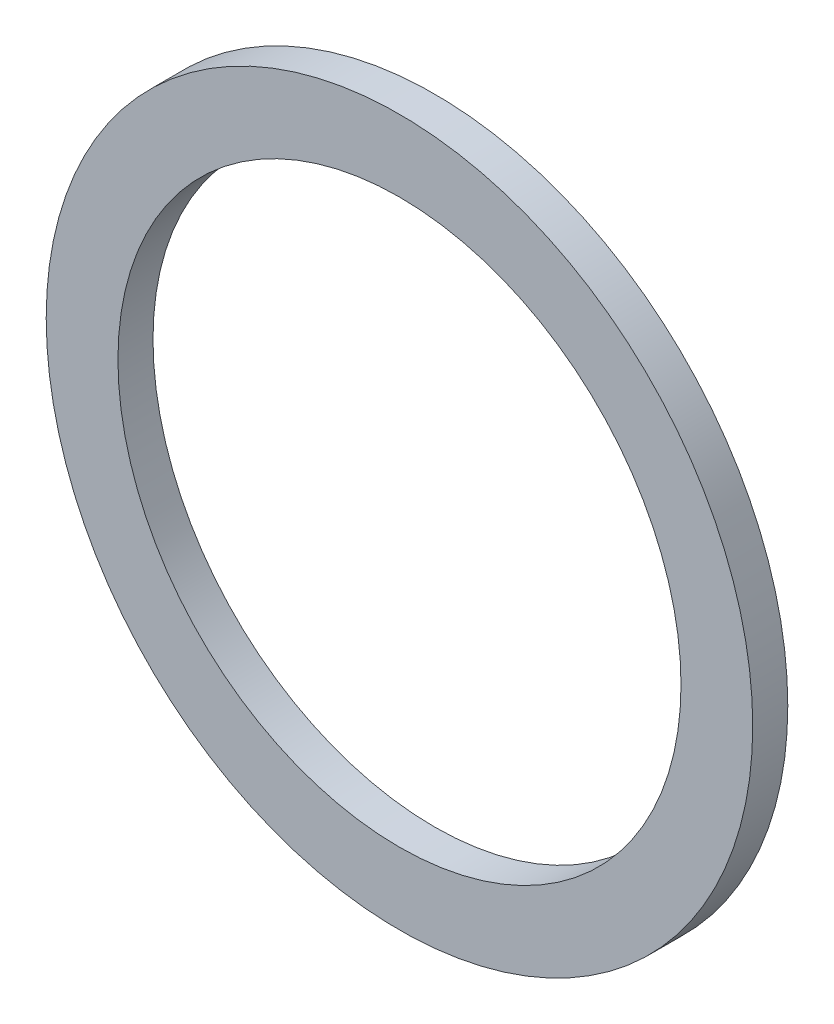
ISO-10303-21;
HEADER;
FILE_DESCRIPTION(('STEP AP214'),'2;1');
FILE_NAME('part.step','',(''),(''),'','','');
FILE_SCHEMA(('AUTOMOTIVE_DESIGN { 1 0 10303 214 1 1 1 1 }'));
ENDSEC;
DATA;
#1=APPLICATION_CONTEXT('core data for automotive mechanical design processes');
#2=APPLICATION_PROTOCOL_DEFINITION('international standard','automotive_design',2000,#1);
#3=PRODUCT_CONTEXT('',#1,'mechanical');
#4=PRODUCT('Part','Part','',(#3));
#5=PRODUCT_RELATED_PRODUCT_CATEGORY('part','',(#4));
#6=PRODUCT_DEFINITION_FORMATION('','',#4);
#7=PRODUCT_DEFINITION_CONTEXT('part definition',#1,'design');
#8=PRODUCT_DEFINITION('design','',#6,#7);
#9=PRODUCT_DEFINITION_SHAPE('','',#8);
#10=(LENGTH_UNIT() NAMED_UNIT(*) SI_UNIT(.MILLI.,.METRE.));
#11=(NAMED_UNIT(*) PLANE_ANGLE_UNIT() SI_UNIT($,.RADIAN.));
#12=(NAMED_UNIT(*) SI_UNIT($,.STERADIAN.) SOLID_ANGLE_UNIT());
#13=UNCERTAINTY_MEASURE_WITH_UNIT(LENGTH_MEASURE(1.E-05),#10,'distance_accuracy_value','');
#14=(GEOMETRIC_REPRESENTATION_CONTEXT(3) GLOBAL_UNCERTAINTY_ASSIGNED_CONTEXT((#13)) GLOBAL_UNIT_ASSIGNED_CONTEXT((#10,
#11,#12)) REPRESENTATION_CONTEXT('',''));
#15=CARTESIAN_POINT('',(0.,0.,0.));
#16=DIRECTION('',(0.,0.,1.));
#17=DIRECTION('',(1.,0.,0.));
#18=AXIS2_PLACEMENT_3D('',#15,#16,#17);
#19=CARTESIAN_POINT('',(0.,0.,3.25));
#20=DIRECTION('',(0.,0.,1.));
#21=DIRECTION('',(1.,0.,0.));
#22=AXIS2_PLACEMENT_3D('',#19,#20,#21);
#23=PLANE('',#22);
#24=CARTESIAN_POINT('',(0.,0.,3.25));
#25=DIRECTION('',(0.,0.,1.));
#26=DIRECTION('',(1.,0.,0.));
#27=AXIS2_PLACEMENT_3D('',#24,#25,#26);
#28=CIRCLE('',#27,32.75);
#29=CARTESIAN_POINT('',(-32.75,0.,3.25));
#30=VERTEX_POINT('',#29);
#31=EDGE_CURVE('E10',#30,#30,#28,.T.);
#32=ORIENTED_EDGE('',*,*,#31,.T.);
#33=EDGE_LOOP('',(#32));
#34=FACE_BOUND('',#33,.T.);
#35=CARTESIAN_POINT('',(0.,0.,3.25));
#36=DIRECTION('',(0.,0.,1.));
#37=DIRECTION('',(1.,0.,0.));
#38=AXIS2_PLACEMENT_3D('',#35,#36,#37);
#39=CIRCLE('',#38,26.1);
#40=CARTESIAN_POINT('',(-26.1,0.,3.25));
#41=VERTEX_POINT('',#40);
#42=EDGE_CURVE('E54',#41,#41,#39,.T.);
#43=ORIENTED_EDGE('',*,*,#42,.F.);
#44=EDGE_LOOP('',(#43));
#45=FACE_BOUND('',#44,.T.);
#46=ADVANCED_FACE('F41',(#34,#45),#23,.T.);
#47=CARTESIAN_POINT('',(0.,0.,0.));
#48=DIRECTION('',(0.,0.,1.));
#49=DIRECTION('',(1.,0.,0.));
#50=AXIS2_PLACEMENT_3D('',#47,#48,#49);
#51=PLANE('',#50);
#52=CARTESIAN_POINT('',(0.,0.,0.));
#53=DIRECTION('',(0.,0.,1.));
#54=DIRECTION('',(1.,0.,0.));
#55=AXIS2_PLACEMENT_3D('',#52,#53,#54);
#56=CIRCLE('',#55,32.75);
#57=CARTESIAN_POINT('',(-32.75,0.,0.));
#58=VERTEX_POINT('',#57);
#59=EDGE_CURVE('E45',#58,#58,#56,.T.);
#60=ORIENTED_EDGE('',*,*,#59,.F.);
#61=EDGE_LOOP('',(#60));
#62=FACE_BOUND('',#61,.T.);
#63=CARTESIAN_POINT('',(0.,0.,0.));
#64=DIRECTION('',(0.,0.,1.));
#65=DIRECTION('',(1.,0.,0.));
#66=AXIS2_PLACEMENT_3D('',#63,#64,#65);
#67=CIRCLE('',#66,26.1);
#68=CARTESIAN_POINT('',(-26.1,0.,0.));
#69=VERTEX_POINT('',#68);
#70=EDGE_CURVE('E56',#69,#69,#67,.T.);
#71=ORIENTED_EDGE('',*,*,#70,.T.);
#72=EDGE_LOOP('',(#71));
#73=FACE_BOUND('',#72,.T.);
#74=ADVANCED_FACE('F68',(#62,#73),#51,.F.);
#75=CARTESIAN_POINT('',(0.,0.,3.25));
#76=DIRECTION('',(0.,0.,-1.));
#77=DIRECTION('',(-1.,0.,0.));
#78=AXIS2_PLACEMENT_3D('',#75,#76,#77);
#79=CYLINDRICAL_SURFACE('',#78,32.75);
#80=CARTESIAN_POINT('',(-32.75,0.,3.25));
#81=CARTESIAN_POINT('',(-32.75,0.,3.21614583333333));
#82=CARTESIAN_POINT('',(-32.75,0.,3.18229166666667));
#83=CARTESIAN_POINT('',(-32.75,0.,3.11458333333333));
#84=CARTESIAN_POINT('',(-32.75,0.,3.08072916666667));
#85=CARTESIAN_POINT('',(-32.75,0.,3.01302083333333));
#86=CARTESIAN_POINT('',(-32.75,0.,2.97916666666667));
#87=CARTESIAN_POINT('',(-32.75,0.,2.91145833333333));
#88=CARTESIAN_POINT('',(-32.75,0.,2.87760416666667));
#89=CARTESIAN_POINT('',(-32.75,0.,2.80989583333333));
#90=CARTESIAN_POINT('',(-32.75,0.,2.77604166666667));
#91=CARTESIAN_POINT('',(-32.75,0.,2.70833333333333));
#92=CARTESIAN_POINT('',(-32.75,0.,2.67447916666667));
#93=CARTESIAN_POINT('',(-32.75,0.,2.60677083333333));
#94=CARTESIAN_POINT('',(-32.75,0.,2.57291666666667));
#95=CARTESIAN_POINT('',(-32.75,0.,2.50520833333333));
#96=CARTESIAN_POINT('',(-32.75,0.,2.47135416666667));
#97=CARTESIAN_POINT('',(-32.75,0.,2.40364583333333));
#98=CARTESIAN_POINT('',(-32.75,0.,2.36979166666667));
#99=CARTESIAN_POINT('',(-32.75,0.,2.30208333333333));
#100=CARTESIAN_POINT('',(-32.75,0.,2.26822916666667));
#101=CARTESIAN_POINT('',(-32.75,0.,2.20052083333333));
#102=CARTESIAN_POINT('',(-32.75,0.,2.16666666666667));
#103=CARTESIAN_POINT('',(-32.75,0.,2.09895833333333));
#104=CARTESIAN_POINT('',(-32.75,0.,2.06510416666667));
#105=CARTESIAN_POINT('',(-32.75,0.,1.99739583333333));
#106=CARTESIAN_POINT('',(-32.75,0.,1.96354166666667));
#107=CARTESIAN_POINT('',(-32.75,0.,1.89583333333333));
#108=CARTESIAN_POINT('',(-32.75,0.,1.86197916666667));
#109=CARTESIAN_POINT('',(-32.75,0.,1.79427083333333));
#110=CARTESIAN_POINT('',(-32.75,0.,1.76041666666667));
#111=CARTESIAN_POINT('',(-32.75,0.,1.69270833333333));
#112=CARTESIAN_POINT('',(-32.75,0.,1.65885416666667));
#113=CARTESIAN_POINT('',(-32.75,0.,1.59114583333333));
#114=CARTESIAN_POINT('',(-32.75,0.,1.55729166666667));
#115=CARTESIAN_POINT('',(-32.75,0.,1.48958333333333));
#116=CARTESIAN_POINT('',(-32.75,0.,1.45572916666667));
#117=CARTESIAN_POINT('',(-32.75,0.,1.38802083333333));
#118=CARTESIAN_POINT('',(-32.75,0.,1.35416666666667));
#119=CARTESIAN_POINT('',(-32.75,0.,1.28645833333333));
#120=CARTESIAN_POINT('',(-32.75,0.,1.25260416666667));
#121=CARTESIAN_POINT('',(-32.75,0.,1.18489583333333));
#122=CARTESIAN_POINT('',(-32.75,0.,1.15104166666667));
#123=CARTESIAN_POINT('',(-32.75,0.,1.08333333333333));
#124=CARTESIAN_POINT('',(-32.75,0.,1.04947916666667));
#125=CARTESIAN_POINT('',(-32.75,0.,0.981770833333333));
#126=CARTESIAN_POINT('',(-32.75,0.,0.947916666666667));
#127=CARTESIAN_POINT('',(-32.75,0.,0.880208333333333));
#128=CARTESIAN_POINT('',(-32.75,0.,0.846354166666667));
#129=CARTESIAN_POINT('',(-32.75,0.,0.778645833333333));
#130=CARTESIAN_POINT('',(-32.75,0.,0.744791666666667));
#131=CARTESIAN_POINT('',(-32.75,0.,0.677083333333333));
#132=CARTESIAN_POINT('',(-32.75,0.,0.643229166666667));
#133=CARTESIAN_POINT('',(-32.75,0.,0.575520833333333));
#134=CARTESIAN_POINT('',(-32.75,0.,0.541666666666667));
#135=CARTESIAN_POINT('',(-32.75,0.,0.473958333333333));
#136=CARTESIAN_POINT('',(-32.75,0.,0.440104166666667));
#137=CARTESIAN_POINT('',(-32.75,0.,0.372395833333333));
#138=CARTESIAN_POINT('',(-32.75,0.,0.338541666666667));
#139=CARTESIAN_POINT('',(-32.75,0.,0.270833333333333));
#140=CARTESIAN_POINT('',(-32.75,0.,0.236979166666667));
#141=CARTESIAN_POINT('',(-32.75,0.,0.169270833333333));
#142=CARTESIAN_POINT('',(-32.75,0.,0.135416666666667));
#143=CARTESIAN_POINT('',(-32.75,0.,0.0677083333333334));
#144=CARTESIAN_POINT('',(-32.75,0.,0.0338541666666667));
#145=CARTESIAN_POINT('',(-32.75,0.,0.));
#146=B_SPLINE_CURVE_WITH_KNOTS('',3,(#80,#81,#82,#83,#84,#85,#86,#87,#88,#89,#90,#91,#92,#93,
#94,#95,#96,#97,#98,#99,#100,#101,#102,#103,#104,#105,#106,#107,#108,#109,#110,#111,#112,#113,
#114,#115,#116,#117,#118,#119,#120,#121,#122,#123,#124,#125,#126,#127,#128,#129,#130,#131,#132,
#133,#134,#135,#136,#137,#138,#139,#140,#141,#142,#143,#144,#145),.UNSPECIFIED.,.F.,.F.,(4,2,2,
2,2,2,2,2,2,2,2,2,2,2,2,2,2,2,2,2,2,2,2,2,2,2,2,2,2,2,2,2,4),(0.,0.1015625,0.203125,0.3046875,
0.40625,0.5078125,0.609375,0.7109375,0.8125,0.9140625,1.015625,1.1171875,1.21875,1.3203125,
1.421875,1.5234375,1.625,1.7265625,1.828125,1.9296875,2.03125,2.1328125,2.234375,2.3359375,
2.4375,2.5390625,2.640625,2.7421875,2.84375,2.9453125,3.046875,3.1484375,3.25),.UNSPECIFIED.);
#147=EDGE_CURVE('BSEAM43',#30,#58,#146,.T.);
#148=ORIENTED_EDGE('',*,*,#31,.F.);
#149=ORIENTED_EDGE('',*,*,#59,.T.);
#150=ORIENTED_EDGE('',*,*,#147,.T.);
#151=ORIENTED_EDGE('',*,*,#147,.F.);
#152=EDGE_LOOP('',(#148,#150,#149,#151));
#153=FACE_BOUND('',#152,.T.);
#154=ADVANCED_FACE('F43',(#153),#79,.T.);
#155=CARTESIAN_POINT('',(0.,0.,3.25));
#156=DIRECTION('',(0.,0.,-1.));
#157=DIRECTION('',(-1.,0.,0.));
#158=AXIS2_PLACEMENT_3D('',#155,#156,#157);
#159=CYLINDRICAL_SURFACE('',#158,26.1);
#160=CARTESIAN_POINT('',(-26.1,0.,3.25));
#161=CARTESIAN_POINT('',(-26.1,0.,3.21614583333333));
#162=CARTESIAN_POINT('',(-26.1,0.,3.18229166666667));
#163=CARTESIAN_POINT('',(-26.1,0.,3.11458333333333));
#164=CARTESIAN_POINT('',(-26.1,0.,3.08072916666667));
#165=CARTESIAN_POINT('',(-26.1,0.,3.01302083333333));
#166=CARTESIAN_POINT('',(-26.1,0.,2.97916666666667));
#167=CARTESIAN_POINT('',(-26.1,0.,2.91145833333333));
#168=CARTESIAN_POINT('',(-26.1,0.,2.87760416666667));
#169=CARTESIAN_POINT('',(-26.1,0.,2.80989583333333));
#170=CARTESIAN_POINT('',(-26.1,0.,2.77604166666667));
#171=CARTESIAN_POINT('',(-26.1,0.,2.70833333333333));
#172=CARTESIAN_POINT('',(-26.1,0.,2.67447916666667));
#173=CARTESIAN_POINT('',(-26.1,0.,2.60677083333333));
#174=CARTESIAN_POINT('',(-26.1,0.,2.57291666666667));
#175=CARTESIAN_POINT('',(-26.1,0.,2.50520833333333));
#176=CARTESIAN_POINT('',(-26.1,0.,2.47135416666667));
#177=CARTESIAN_POINT('',(-26.1,0.,2.40364583333333));
#178=CARTESIAN_POINT('',(-26.1,0.,2.36979166666667));
#179=CARTESIAN_POINT('',(-26.1,0.,2.30208333333333));
#180=CARTESIAN_POINT('',(-26.1,0.,2.26822916666667));
#181=CARTESIAN_POINT('',(-26.1,0.,2.20052083333333));
#182=CARTESIAN_POINT('',(-26.1,0.,2.16666666666667));
#183=CARTESIAN_POINT('',(-26.1,0.,2.09895833333333));
#184=CARTESIAN_POINT('',(-26.1,0.,2.06510416666667));
#185=CARTESIAN_POINT('',(-26.1,0.,1.99739583333333));
#186=CARTESIAN_POINT('',(-26.1,0.,1.96354166666667));
#187=CARTESIAN_POINT('',(-26.1,0.,1.89583333333333));
#188=CARTESIAN_POINT('',(-26.1,0.,1.86197916666667));
#189=CARTESIAN_POINT('',(-26.1,0.,1.79427083333333));
#190=CARTESIAN_POINT('',(-26.1,0.,1.76041666666667));
#191=CARTESIAN_POINT('',(-26.1,0.,1.69270833333333));
#192=CARTESIAN_POINT('',(-26.1,0.,1.65885416666667));
#193=CARTESIAN_POINT('',(-26.1,0.,1.59114583333333));
#194=CARTESIAN_POINT('',(-26.1,0.,1.55729166666667));
#195=CARTESIAN_POINT('',(-26.1,0.,1.48958333333333));
#196=CARTESIAN_POINT('',(-26.1,0.,1.45572916666667));
#197=CARTESIAN_POINT('',(-26.1,0.,1.38802083333333));
#198=CARTESIAN_POINT('',(-26.1,0.,1.35416666666667));
#199=CARTESIAN_POINT('',(-26.1,0.,1.28645833333333));
#200=CARTESIAN_POINT('',(-26.1,0.,1.25260416666667));
#201=CARTESIAN_POINT('',(-26.1,0.,1.18489583333333));
#202=CARTESIAN_POINT('',(-26.1,0.,1.15104166666667));
#203=CARTESIAN_POINT('',(-26.1,0.,1.08333333333333));
#204=CARTESIAN_POINT('',(-26.1,0.,1.04947916666667));
#205=CARTESIAN_POINT('',(-26.1,0.,0.981770833333333));
#206=CARTESIAN_POINT('',(-26.1,0.,0.947916666666667));
#207=CARTESIAN_POINT('',(-26.1,0.,0.880208333333333));
#208=CARTESIAN_POINT('',(-26.1,0.,0.846354166666667));
#209=CARTESIAN_POINT('',(-26.1,0.,0.778645833333333));
#210=CARTESIAN_POINT('',(-26.1,0.,0.744791666666667));
#211=CARTESIAN_POINT('',(-26.1,0.,0.677083333333333));
#212=CARTESIAN_POINT('',(-26.1,0.,0.643229166666667));
#213=CARTESIAN_POINT('',(-26.1,0.,0.575520833333333));
#214=CARTESIAN_POINT('',(-26.1,0.,0.541666666666667));
#215=CARTESIAN_POINT('',(-26.1,0.,0.473958333333333));
#216=CARTESIAN_POINT('',(-26.1,0.,0.440104166666667));
#217=CARTESIAN_POINT('',(-26.1,0.,0.372395833333333));
#218=CARTESIAN_POINT('',(-26.1,0.,0.338541666666667));
#219=CARTESIAN_POINT('',(-26.1,0.,0.270833333333333));
#220=CARTESIAN_POINT('',(-26.1,0.,0.236979166666667));
#221=CARTESIAN_POINT('',(-26.1,0.,0.169270833333333));
#222=CARTESIAN_POINT('',(-26.1,0.,0.135416666666667));
#223=CARTESIAN_POINT('',(-26.1,0.,0.0677083333333334));
#224=CARTESIAN_POINT('',(-26.1,0.,0.0338541666666667));
#225=CARTESIAN_POINT('',(-26.1,0.,0.));
#226=B_SPLINE_CURVE_WITH_KNOTS('',3,(#160,#161,#162,#163,#164,#165,#166,#167,#168,#169,#170,
#171,#172,#173,#174,#175,#176,#177,#178,#179,#180,#181,#182,#183,#184,#185,#186,#187,#188,#189,
#190,#191,#192,#193,#194,#195,#196,#197,#198,#199,#200,#201,#202,#203,#204,#205,#206,#207,#208,
#209,#210,#211,#212,#213,#214,#215,#216,#217,#218,#219,#220,#221,#222,#223,#224,#225),
.UNSPECIFIED.,.F.,.F.,(4,2,2,2,2,2,2,2,2,2,2,2,2,2,2,2,2,2,2,2,2,2,2,2,2,2,2,2,2,2,2,2,4),(0.,
0.1015625,0.203125,0.3046875,0.40625,0.5078125,0.609375,0.7109375,0.8125,0.9140625,1.015625,
1.1171875,1.21875,1.3203125,1.421875,1.5234375,1.625,1.7265625,1.828125,1.9296875,2.03125,
2.1328125,2.234375,2.3359375,2.4375,2.5390625,2.640625,2.7421875,2.84375,2.9453125,3.046875,
3.1484375,3.25),.UNSPECIFIED.);
#227=EDGE_CURVE('BSEAM64',#41,#69,#226,.T.);
#228=ORIENTED_EDGE('',*,*,#42,.T.);
#229=ORIENTED_EDGE('',*,*,#70,.F.);
#230=ORIENTED_EDGE('',*,*,#227,.T.);
#231=ORIENTED_EDGE('',*,*,#227,.F.);
#232=EDGE_LOOP('',(#228,#230,#229,#231));
#233=FACE_BOUND('',#232,.T.);
#234=ADVANCED_FACE('F64',(#233),#159,.F.);
#235=CLOSED_SHELL('',(#46,#74,#154,#234));
#236=MANIFOLD_SOLID_BREP('B2',#235);
#237=ADVANCED_BREP_SHAPE_REPRESENTATION('',(#18,#236),#14);
#238=SHAPE_DEFINITION_REPRESENTATION(#9,#237);
ENDSEC;
END-ISO-10303-21;
